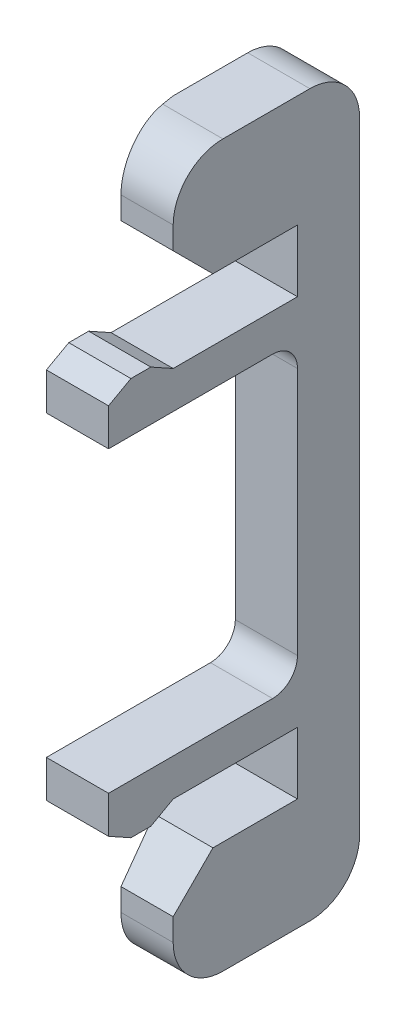
ISO-10303-21;
HEADER;
FILE_DESCRIPTION(('STEP AP214'),'2;1');
FILE_NAME('part.step','',(''),(''),'','','');
FILE_SCHEMA(('AUTOMOTIVE_DESIGN { 1 0 10303 214 1 1 1 1 }'));
ENDSEC;
DATA;
#1=APPLICATION_CONTEXT('core data for automotive mechanical design processes');
#2=APPLICATION_PROTOCOL_DEFINITION('international standard','automotive_design',2000,#1);
#3=PRODUCT_CONTEXT('',#1,'mechanical');
#4=PRODUCT('Part','Part','',(#3));
#5=PRODUCT_RELATED_PRODUCT_CATEGORY('part','',(#4));
#6=PRODUCT_DEFINITION_FORMATION('','',#4);
#7=PRODUCT_DEFINITION_CONTEXT('part definition',#1,'design');
#8=PRODUCT_DEFINITION('design','',#6,#7);
#9=PRODUCT_DEFINITION_SHAPE('','',#8);
#10=(LENGTH_UNIT() NAMED_UNIT(*) SI_UNIT(.MILLI.,.METRE.));
#11=(NAMED_UNIT(*) PLANE_ANGLE_UNIT() SI_UNIT($,.RADIAN.));
#12=(NAMED_UNIT(*) SI_UNIT($,.STERADIAN.) SOLID_ANGLE_UNIT());
#13=UNCERTAINTY_MEASURE_WITH_UNIT(LENGTH_MEASURE(1.E-05),#10,'distance_accuracy_value','');
#14=(GEOMETRIC_REPRESENTATION_CONTEXT(3) GLOBAL_UNCERTAINTY_ASSIGNED_CONTEXT((#13)) GLOBAL_UNIT_ASSIGNED_CONTEXT((#10,
#11,#12)) REPRESENTATION_CONTEXT('',''));
#15=CARTESIAN_POINT('',(0.,0.,0.));
#16=DIRECTION('',(0.,0.,1.));
#17=DIRECTION('',(1.,0.,0.));
#18=AXIS2_PLACEMENT_3D('',#15,#16,#17);
#19=CARTESIAN_POINT('',(-1.5875,-18.415,3.175));
#20=DIRECTION('',(1.,0.,0.));
#21=DIRECTION('',(0.,0.,-1.));
#22=AXIS2_PLACEMENT_3D('',#19,#20,#21);
#23=PLANE('',#22);
#24=DIRECTION('',(0.,-1.,0.));
#25=VECTOR('',#24,1.);
#26=CARTESIAN_POINT('',(-1.5875,18.416,6.35));
#27=LINE('',#26,#25);
#28=CARTESIAN_POINT('',(-1.5875,-12.7,6.35));
#29=VERTEX_POINT('',#28);
#30=CARTESIAN_POINT('',(-1.5875,-18.415,6.35));
#31=VERTEX_POINT('',#30);
#32=EDGE_CURVE('E278',#29,#31,#27,.T.);
#33=ORIENTED_EDGE('',*,*,#32,.F.);
#34=DIRECTION('',(0.,0.,-1.));
#35=VECTOR('',#34,1.);
#36=CARTESIAN_POINT('',(-1.5875,-12.7,3.175));
#37=LINE('',#36,#35);
#38=CARTESIAN_POINT('',(-1.5875,-12.7,3.175));
#39=VERTEX_POINT('',#38);
#40=EDGE_CURVE('E501',#29,#39,#37,.T.);
#41=ORIENTED_EDGE('',*,*,#40,.T.);
#42=DIRECTION('',(0.,-1.,0.));
#43=VECTOR('',#42,1.);
#44=CARTESIAN_POINT('',(-1.5875,-18.415,3.175));
#45=LINE('',#44,#43);
#46=CARTESIAN_POINT('',(-1.5875,-9.525,3.175));
#47=VERTEX_POINT('',#46);
#48=EDGE_CURVE('E523',#47,#39,#45,.T.);
#49=ORIENTED_EDGE('',*,*,#48,.F.);
#50=DIRECTION('',(0.,0.,1.));
#51=VECTOR('',#50,1.);
#52=CARTESIAN_POINT('',(-1.5875,-9.525,3.175));
#53=LINE('',#52,#51);
#54=CARTESIAN_POINT('',(-1.5875,-9.525,9.525));
#55=VERTEX_POINT('',#54);
#56=EDGE_CURVE('E392',#47,#55,#53,.T.);
#57=ORIENTED_EDGE('',*,*,#56,.T.);
#58=DIRECTION('',(0.,-0.485642931178632,0.874157276121538));
#59=VECTOR('',#58,1.);
#60=CARTESIAN_POINT('',(-1.5875,-9.525,9.525));
#61=LINE('',#60,#59);
#62=CARTESIAN_POINT('',(-1.5875,-10.16,10.668));
#63=VERTEX_POINT('',#62);
#64=EDGE_CURVE('E473',#55,#63,#61,.T.);
#65=ORIENTED_EDGE('',*,*,#64,.T.);
#66=DIRECTION('',(0.,0.,1.));
#67=VECTOR('',#66,1.);
#68=CARTESIAN_POINT('',(-1.5875,-10.16,10.668));
#69=LINE('',#68,#67);
#70=CARTESIAN_POINT('',(-1.5875,-10.16,11.684));
#71=VERTEX_POINT('',#70);
#72=EDGE_CURVE('E469',#63,#71,#69,.T.);
#73=ORIENTED_EDGE('',*,*,#72,.T.);
#74=DIRECTION('',(0.,0.485642931178633,0.874157276121537));
#75=VECTOR('',#74,1.);
#76=CARTESIAN_POINT('',(-1.5875,-10.16,11.684));
#77=LINE('',#76,#75);
#78=CARTESIAN_POINT('',(-1.5875,-9.525,12.827));
#79=VERTEX_POINT('',#78);
#80=EDGE_CURVE('E465',#71,#79,#77,.T.);
#81=ORIENTED_EDGE('',*,*,#80,.T.);
#82=DIRECTION('',(0.,1.,0.));
#83=VECTOR('',#82,1.);
#84=CARTESIAN_POINT('',(-1.5875,-9.525,12.827));
#85=LINE('',#84,#83);
#86=CARTESIAN_POINT('',(-1.5875,-7.62,12.827));
#87=VERTEX_POINT('',#86);
#88=EDGE_CURVE('E461',#79,#87,#85,.T.);
#89=ORIENTED_EDGE('',*,*,#88,.T.);
#90=DIRECTION('',(0.,0.,-1.));
#91=VECTOR('',#90,1.);
#92=CARTESIAN_POINT('',(-1.5875,-7.62,12.827));
#93=LINE('',#92,#91);
#94=CARTESIAN_POINT('',(-1.5875,-7.62,4.445));
#95=VERTEX_POINT('',#94);
#96=EDGE_CURVE('E442',#87,#95,#93,.T.);
#97=ORIENTED_EDGE('',*,*,#96,.T.);
#98=CARTESIAN_POINT('',(-1.5875,-6.35,4.445));
#99=DIRECTION('',(1.,0.,0.));
#100=DIRECTION('',(0.,0.,-1.));
#101=AXIS2_PLACEMENT_3D('',#98,#99,#100);
#102=CIRCLE('',#101,1.27);
#103=CARTESIAN_POINT('',(-1.5875,-6.35,3.175));
#104=VERTEX_POINT('',#103);
#105=EDGE_CURVE('E564',#95,#104,#102,.T.);
#106=ORIENTED_EDGE('',*,*,#105,.T.);
#107=CARTESIAN_POINT('',(-1.5875,6.35,3.175));
#108=VERTEX_POINT('',#107);
#109=EDGE_CURVE('E530',#108,#104,#45,.T.);
#110=ORIENTED_EDGE('',*,*,#109,.F.);
#111=CARTESIAN_POINT('',(-1.5875,6.35,4.445));
#112=DIRECTION('',(1.,0.,0.));
#113=DIRECTION('',(0.,0.,-1.));
#114=AXIS2_PLACEMENT_3D('',#111,#112,#113);
#115=CIRCLE('',#114,1.27);
#116=CARTESIAN_POINT('',(-1.5875,7.62,4.445));
#117=VERTEX_POINT('',#116);
#118=EDGE_CURVE('E569',#108,#117,#115,.T.);
#119=ORIENTED_EDGE('',*,*,#118,.T.);
#120=DIRECTION('',(0.,0.,1.));
#121=VECTOR('',#120,1.);
#122=CARTESIAN_POINT('',(-1.5875,7.62,12.827));
#123=LINE('',#122,#121);
#124=CARTESIAN_POINT('',(-1.5875,7.62,12.827));
#125=VERTEX_POINT('',#124);
#126=EDGE_CURVE('E388',#117,#125,#123,.T.);
#127=ORIENTED_EDGE('',*,*,#126,.T.);
#128=DIRECTION('',(0.,1.,0.));
#129=VECTOR('',#128,1.);
#130=CARTESIAN_POINT('',(-1.5875,9.525,12.827));
#131=LINE('',#130,#129);
#132=CARTESIAN_POINT('',(-1.5875,9.525,12.827));
#133=VERTEX_POINT('',#132);
#134=EDGE_CURVE('E391',#125,#133,#131,.T.);
#135=ORIENTED_EDGE('',*,*,#134,.T.);
#136=DIRECTION('',(0.,0.485642931178633,-0.874157276121537));
#137=VECTOR('',#136,1.);
#138=CARTESIAN_POINT('',(-1.5875,10.16,11.684));
#139=LINE('',#138,#137);
#140=CARTESIAN_POINT('',(-1.5875,10.16,11.684));
#141=VERTEX_POINT('',#140);
#142=EDGE_CURVE('E396',#133,#141,#139,.T.);
#143=ORIENTED_EDGE('',*,*,#142,.T.);
#144=DIRECTION('',(0.,0.,-1.));
#145=VECTOR('',#144,1.);
#146=CARTESIAN_POINT('',(-1.5875,10.16,10.668));
#147=LINE('',#146,#145);
#148=CARTESIAN_POINT('',(-1.5875,10.16,10.668));
#149=VERTEX_POINT('',#148);
#150=EDGE_CURVE('E400',#141,#149,#147,.T.);
#151=ORIENTED_EDGE('',*,*,#150,.T.);
#152=DIRECTION('',(0.,-0.485642931178632,-0.874157276121538));
#153=VECTOR('',#152,1.);
#154=CARTESIAN_POINT('',(-1.5875,9.525,9.525));
#155=LINE('',#154,#153);
#156=CARTESIAN_POINT('',(-1.5875,9.525,9.525));
#157=VERTEX_POINT('',#156);
#158=EDGE_CURVE('E404',#149,#157,#155,.T.);
#159=ORIENTED_EDGE('',*,*,#158,.T.);
#160=DIRECTION('',(0.,0.,-1.));
#161=VECTOR('',#160,1.);
#162=CARTESIAN_POINT('',(-1.5875,9.525,3.175));
#163=LINE('',#162,#161);
#164=CARTESIAN_POINT('',(-1.5875,9.525,3.175));
#165=VERTEX_POINT('',#164);
#166=EDGE_CURVE('E408',#157,#165,#163,.T.);
#167=ORIENTED_EDGE('',*,*,#166,.T.);
#168=CARTESIAN_POINT('',(-1.5875,12.7,3.175));
#169=VERTEX_POINT('',#168);
#170=EDGE_CURVE('E526',#169,#165,#45,.T.);
#171=ORIENTED_EDGE('',*,*,#170,.F.);
#172=DIRECTION('',(0.,0.,1.));
#173=VECTOR('',#172,1.);
#174=CARTESIAN_POINT('',(-1.5875,12.7,3.175));
#175=LINE('',#174,#173);
#176=CARTESIAN_POINT('',(-1.5875,12.7,6.34999999999997));
#177=VERTEX_POINT('',#176);
#178=EDGE_CURVE('E498',#169,#177,#175,.T.);
#179=ORIENTED_EDGE('',*,*,#178,.T.);
#180=DIRECTION('',(0.,1.,0.));
#181=VECTOR('',#180,1.);
#182=CARTESIAN_POINT('',(-1.5875,-18.416,6.35));
#183=LINE('',#182,#181);
#184=CARTESIAN_POINT('',(-1.5875,18.415,6.35));
#185=VERTEX_POINT('',#184);
#186=EDGE_CURVE('E355',#177,#185,#183,.T.);
#187=ORIENTED_EDGE('',*,*,#186,.T.);
#188=DIRECTION('',(0.,0.,-1.));
#189=VECTOR('',#188,1.);
#190=CARTESIAN_POINT('',(-1.5875,18.415,3.175));
#191=LINE('',#190,#189);
#192=CARTESIAN_POINT('',(-1.5875,18.415,2.54));
#193=VERTEX_POINT('',#192);
#194=EDGE_CURVE('E544',#185,#193,#191,.T.);
#195=ORIENTED_EDGE('',*,*,#194,.T.);
#196=CARTESIAN_POINT('',(-1.5875,15.875,2.54));
#197=DIRECTION('',(1.,0.,0.));
#198=DIRECTION('',(0.,0.,-1.));
#199=AXIS2_PLACEMENT_3D('',#196,#197,#198);
#200=CIRCLE('',#199,2.54);
#201=CARTESIAN_POINT('',(-1.5875,15.875,0.));
#202=VERTEX_POINT('',#201);
#203=EDGE_CURVE('E285',#193,#202,#200,.F.);
#204=ORIENTED_EDGE('',*,*,#203,.T.);
#205=DIRECTION('',(0.,-1.,0.));
#206=VECTOR('',#205,1.);
#207=CARTESIAN_POINT('',(-1.5875,-18.415,0.));
#208=LINE('',#207,#206);
#209=CARTESIAN_POINT('',(-1.5875,-15.875,0.));
#210=VERTEX_POINT('',#209);
#211=EDGE_CURVE('E534',#202,#210,#208,.T.);
#212=ORIENTED_EDGE('',*,*,#211,.T.);
#213=CARTESIAN_POINT('',(-1.5875,-15.875,2.54));
#214=DIRECTION('',(1.,0.,0.));
#215=DIRECTION('',(0.,0.,-1.));
#216=AXIS2_PLACEMENT_3D('',#213,#214,#215);
#217=CIRCLE('',#216,2.54);
#218=CARTESIAN_POINT('',(-1.5875,-18.415,2.54));
#219=VERTEX_POINT('',#218);
#220=EDGE_CURVE('E294',#210,#219,#217,.F.);
#221=ORIENTED_EDGE('',*,*,#220,.T.);
#222=DIRECTION('',(0.,0.,-1.));
#223=VECTOR('',#222,1.);
#224=CARTESIAN_POINT('',(-1.5875,-18.415,3.175));
#225=LINE('',#224,#223);
#226=EDGE_CURVE('E541',#31,#219,#225,.T.);
#227=ORIENTED_EDGE('',*,*,#226,.F.);
#228=EDGE_LOOP('',(#33,#41,#49,#57,#65,#73,#81,#89,#97,#106,#110,#119,#127,#135,#143,#151,#159,
#167,#171,#179,#187,#195,#204,#212,#221,#227));
#229=FACE_BOUND('',#228,.T.);
#230=ADVANCED_FACE('F51',(#229),#23,.F.);
#231=CARTESIAN_POINT('',(-1.5875,-18.415,3.175));
#232=DIRECTION('',(0.,1.,0.));
#233=DIRECTION('',(0.,0.,1.));
#234=AXIS2_PLACEMENT_3D('',#231,#232,#233);
#235=PLANE('',#234);
#236=DIRECTION('',(-0.157990501106673,0.,-0.987440631916705));
#237=VECTOR('',#236,1.);
#238=CARTESIAN_POINT('',(-1.5875,-18.415,6.35));
#239=LINE('',#238,#237);
#240=CARTESIAN_POINT('',(-1.4859,-18.415,6.985));
#241=VERTEX_POINT('',#240);
#242=EDGE_CURVE('E262',#241,#31,#239,.T.);
#243=ORIENTED_EDGE('',*,*,#242,.T.);
#244=ORIENTED_EDGE('',*,*,#226,.T.);
#245=DIRECTION('',(1.,0.,0.));
#246=VECTOR('',#245,1.);
#247=CARTESIAN_POINT('',(1.5875,-18.415,2.54));
#248=LINE('',#247,#246);
#249=CARTESIAN_POINT('',(1.5875,-18.415,2.54));
#250=VERTEX_POINT('',#249);
#251=EDGE_CURVE('E575',#219,#250,#248,.T.);
#252=ORIENTED_EDGE('',*,*,#251,.T.);
#253=DIRECTION('',(0.,0.,-1.));
#254=VECTOR('',#253,1.);
#255=CARTESIAN_POINT('',(1.5875,-18.415,3.175));
#256=LINE('',#255,#254);
#257=CARTESIAN_POINT('',(1.5875,-18.415,6.985));
#258=VERTEX_POINT('',#257);
#259=EDGE_CURVE('E529',#258,#250,#256,.T.);
#260=ORIENTED_EDGE('',*,*,#259,.F.);
#261=DIRECTION('',(-1.,0.,0.));
#262=VECTOR('',#261,1.);
#263=CARTESIAN_POINT('',(-1.5875,-18.415,6.985));
#264=LINE('',#263,#262);
#265=EDGE_CURVE('E579',#258,#241,#264,.T.);
#266=ORIENTED_EDGE('',*,*,#265,.T.);
#267=EDGE_LOOP('',(#243,#244,#252,#260,#266));
#268=FACE_BOUND('',#267,.T.);
#269=ADVANCED_FACE('F595',(#268),#235,.F.);
#270=CARTESIAN_POINT('',(10.1305512698918,-12.7,3.175));
#271=DIRECTION('',(0.,1.,0.));
#272=DIRECTION('',(0.,0.,1.));
#273=AXIS2_PLACEMENT_3D('',#270,#271,#272);
#274=PLANE('',#273);
#275=ORIENTED_EDGE('',*,*,#40,.F.);
#276=DIRECTION('',(-0.157990501106673,0.,-0.987440631916706));
#277=VECTOR('',#276,1.);
#278=CARTESIAN_POINT('',(-1.5875,-12.7,6.35));
#279=LINE('',#278,#277);
#280=CARTESIAN_POINT('',(-1.40462,-12.7,7.49299999999999));
#281=VERTEX_POINT('',#280);
#282=EDGE_CURVE('E370',#281,#29,#279,.T.);
#283=ORIENTED_EDGE('',*,*,#282,.F.);
#284=DIRECTION('',(1.,0.,0.));
#285=VECTOR('',#284,1.);
#286=CARTESIAN_POINT('',(10.1305512698918,-12.7,7.49299999999999));
#287=LINE('',#286,#285);
#288=CARTESIAN_POINT('',(1.5875,-12.7,7.49299999999999));
#289=VERTEX_POINT('',#288);
#290=EDGE_CURVE('E324',#281,#289,#287,.T.);
#291=ORIENTED_EDGE('',*,*,#290,.T.);
#292=DIRECTION('',(0.,0.,1.));
#293=VECTOR('',#292,1.);
#294=CARTESIAN_POINT('',(1.5875,-12.7,3.175));
#295=LINE('',#294,#293);
#296=CARTESIAN_POINT('',(1.5875,-12.7,3.175));
#297=VERTEX_POINT('',#296);
#298=EDGE_CURVE('E433',#297,#289,#295,.T.);
#299=ORIENTED_EDGE('',*,*,#298,.F.);
#300=DIRECTION('',(-1.,0.,0.));
#301=VECTOR('',#300,1.);
#302=CARTESIAN_POINT('',(10.1305512698918,-12.7,3.175));
#303=LINE('',#302,#301);
#304=EDGE_CURVE('E508',#297,#39,#303,.T.);
#305=ORIENTED_EDGE('',*,*,#304,.T.);
#306=EDGE_LOOP('',(#275,#283,#291,#299,#305));
#307=FACE_BOUND('',#306,.T.);
#308=ADVANCED_FACE('F816',(#307),#274,.T.);
#309=CARTESIAN_POINT('',(10.1305512698918,-18.415,9.525));
#310=DIRECTION('',(0.,0.,1.));
#311=DIRECTION('',(1.,0.,0.));
#312=AXIS2_PLACEMENT_3D('',#309,#310,#311);
#313=PLANE('',#312);
#314=DIRECTION('',(-1.,0.,0.));
#315=VECTOR('',#314,1.);
#316=CARTESIAN_POINT('',(10.1305512698918,-14.732,9.525));
#317=LINE('',#316,#315);
#318=CARTESIAN_POINT('',(1.5875,-14.732,9.525));
#319=VERTEX_POINT('',#318);
#320=CARTESIAN_POINT('',(-1.0795,-14.732,9.525));
#321=VERTEX_POINT('',#320);
#322=EDGE_CURVE('E276',#319,#321,#317,.T.);
#323=ORIENTED_EDGE('',*,*,#322,.T.);
#324=DIRECTION('',(0.,-1.,0.));
#325=VECTOR('',#324,1.);
#326=CARTESIAN_POINT('',(-1.0795,18.416,9.525));
#327=LINE('',#326,#325);
#328=CARTESIAN_POINT('',(-1.0795,-15.875,9.525));
#329=VERTEX_POINT('',#328);
#330=EDGE_CURVE('E68',#321,#329,#327,.T.);
#331=ORIENTED_EDGE('',*,*,#330,.T.);
#332=DIRECTION('',(-1.,0.,0.));
#333=VECTOR('',#332,1.);
#334=CARTESIAN_POINT('',(1.5875,-15.875,9.525));
#335=LINE('',#334,#333);
#336=CARTESIAN_POINT('',(1.5875,-15.875,9.525));
#337=VERTEX_POINT('',#336);
#338=EDGE_CURVE('E273',#329,#337,#335,.F.);
#339=ORIENTED_EDGE('',*,*,#338,.T.);
#340=DIRECTION('',(0.,-1.,0.));
#341=VECTOR('',#340,1.);
#342=CARTESIAN_POINT('',(1.5875,-18.415,9.525));
#343=LINE('',#342,#341);
#344=EDGE_CURVE('E512',#319,#337,#343,.T.);
#345=ORIENTED_EDGE('',*,*,#344,.F.);
#346=EDGE_LOOP('',(#323,#331,#339,#345));
#347=FACE_BOUND('',#346,.T.);
#348=ADVANCED_FACE('F271',(#347),#313,.T.);
#349=CARTESIAN_POINT('',(-1.5875,-15.875,6.985));
#350=DIRECTION('',(1.,0.,0.));
#351=DIRECTION('',(0.,0.,-1.));
#352=AXIS2_PLACEMENT_3D('',#349,#350,#351);
#353=CYLINDRICAL_SURFACE('',#352,2.54);
#354=ORIENTED_EDGE('',*,*,#338,.F.);
#355=CARTESIAN_POINT('',(-1.4859,-15.875,6.985));
#356=DIRECTION('',(-0.987440631916705,0.,0.157990501106673));
#357=DIRECTION('',(0.157990501106673,0.,0.987440631916706));
#358=AXIS2_PLACEMENT_3D('',#355,#356,#357);
#359=ELLIPSE('',#358,2.57230654471818,2.54);
#360=EDGE_CURVE('E259',#241,#329,#359,.T.);
#361=ORIENTED_EDGE('',*,*,#360,.F.);
#362=ORIENTED_EDGE('',*,*,#265,.F.);
#363=CARTESIAN_POINT('',(1.5875,-15.875,6.985));
#364=DIRECTION('',(-1.,0.,0.));
#365=DIRECTION('',(0.,0.,1.));
#366=AXIS2_PLACEMENT_3D('',#363,#364,#365);
#367=CIRCLE('',#366,2.54);
#368=EDGE_CURVE('E282',#337,#258,#367,.F.);
#369=ORIENTED_EDGE('',*,*,#368,.F.);
#370=EDGE_LOOP('',(#354,#361,#362,#369));
#371=FACE_BOUND('',#370,.T.);
#372=ADVANCED_FACE('F281',(#371),#353,.T.);
#373=CARTESIAN_POINT('',(10.1305512698918,-14.732,9.525));
#374=DIRECTION('',(0.,-0.707106781186549,-0.707106781186546));
#375=DIRECTION('',(-1.,0.,0.));
#376=AXIS2_PLACEMENT_3D('',#373,#374,#375);
#377=PLANE('',#376);
#378=ORIENTED_EDGE('',*,*,#290,.F.);
#379=DIRECTION('',(0.112419885463869,-0.702624284149177,0.70262428414918));
#380=VECTOR('',#379,1.);
#381=CARTESIAN_POINT('',(-3.9550355450237,3.24009715639805,-8.44709715639811));
#382=LINE('',#381,#380);
#383=EDGE_CURVE('E603',#321,#281,#382,.F.);
#384=ORIENTED_EDGE('',*,*,#383,.F.);
#385=ORIENTED_EDGE('',*,*,#322,.F.);
#386=DIRECTION('',(0.,0.707106781186546,-0.707106781186549));
#387=VECTOR('',#386,1.);
#388=CARTESIAN_POINT('',(1.5875,-14.732,9.525));
#389=LINE('',#388,#387);
#390=EDGE_CURVE('E330',#289,#319,#389,.F.);
#391=ORIENTED_EDGE('',*,*,#390,.F.);
#392=EDGE_LOOP('',(#378,#384,#385,#391));
#393=FACE_BOUND('',#392,.T.);
#394=ADVANCED_FACE('F602',(#393),#377,.F.);
#395=CARTESIAN_POINT('',(0.,0.,3.175));
#396=DIRECTION('',(0.,0.,-1.));
#397=DIRECTION('',(-1.,0.,0.));
#398=AXIS2_PLACEMENT_3D('',#395,#396,#397);
#399=PLANE('',#398);
#400=ORIENTED_EDGE('',*,*,#170,.T.);
#401=DIRECTION('',(-1.,0.,0.));
#402=VECTOR('',#401,1.);
#403=CARTESIAN_POINT('',(11.5681164138294,9.525,3.175));
#404=LINE('',#403,#402);
#405=CARTESIAN_POINT('',(1.5875,9.525,3.175));
#406=VERTEX_POINT('',#405);
#407=EDGE_CURVE('E375',#406,#165,#404,.T.);
#408=ORIENTED_EDGE('',*,*,#407,.F.);
#409=DIRECTION('',(0.,1.,0.));
#410=VECTOR('',#409,1.);
#411=CARTESIAN_POINT('',(1.5875,-18.415,3.175));
#412=LINE('',#411,#410);
#413=CARTESIAN_POINT('',(1.5875,12.7,3.175));
#414=VERTEX_POINT('',#413);
#415=EDGE_CURVE('E525',#406,#414,#412,.T.);
#416=ORIENTED_EDGE('',*,*,#415,.T.);
#417=DIRECTION('',(-1.,0.,0.));
#418=VECTOR('',#417,1.);
#419=CARTESIAN_POINT('',(10.1305512698918,12.7,3.175));
#420=LINE('',#419,#418);
#421=EDGE_CURVE('E497',#414,#169,#420,.T.);
#422=ORIENTED_EDGE('',*,*,#421,.T.);
#423=EDGE_LOOP('',(#400,#408,#416,#422));
#424=FACE_BOUND('',#423,.T.);
#425=ADVANCED_FACE('F736',(#424),#399,.F.);
#426=ORIENTED_EDGE('',*,*,#109,.T.);
#427=DIRECTION('',(-1.,0.,0.));
#428=VECTOR('',#427,1.);
#429=CARTESIAN_POINT('',(0.,-6.35,3.175));
#430=LINE('',#429,#428);
#431=CARTESIAN_POINT('',(1.5875,-6.35,3.175));
#432=VERTEX_POINT('',#431);
#433=EDGE_CURVE('E559',#104,#432,#430,.F.);
#434=ORIENTED_EDGE('',*,*,#433,.T.);
#435=CARTESIAN_POINT('',(1.5875,6.35,3.175));
#436=VERTEX_POINT('',#435);
#437=EDGE_CURVE('E524',#432,#436,#412,.T.);
#438=ORIENTED_EDGE('',*,*,#437,.T.);
#439=DIRECTION('',(-1.,0.,0.));
#440=VECTOR('',#439,1.);
#441=CARTESIAN_POINT('',(0.,6.35,3.175));
#442=LINE('',#441,#440);
#443=EDGE_CURVE('E555',#436,#108,#442,.T.);
#444=ORIENTED_EDGE('',*,*,#443,.T.);
#445=EDGE_LOOP('',(#426,#434,#438,#444));
#446=FACE_BOUND('',#445,.T.);
#447=ADVANCED_FACE('F773',(#446),#399,.F.);
#448=CARTESIAN_POINT('',(1.5875,-9.525,3.175));
#449=VERTEX_POINT('',#448);
#450=EDGE_CURVE('E520',#297,#449,#412,.T.);
#451=ORIENTED_EDGE('',*,*,#450,.T.);
#452=DIRECTION('',(-1.,0.,0.));
#453=VECTOR('',#452,1.);
#454=CARTESIAN_POINT('',(11.5681164138294,-9.525,3.175));
#455=LINE('',#454,#453);
#456=EDGE_CURVE('E438',#449,#47,#455,.T.);
#457=ORIENTED_EDGE('',*,*,#456,.T.);
#458=ORIENTED_EDGE('',*,*,#48,.T.);
#459=ORIENTED_EDGE('',*,*,#304,.F.);
#460=EDGE_LOOP('',(#451,#457,#458,#459));
#461=FACE_BOUND('',#460,.T.);
#462=ADVANCED_FACE('F813',(#461),#399,.F.);
#463=CARTESIAN_POINT('',(1.5875,-18.415,3.175));
#464=DIRECTION('',(-1.,0.,0.));
#465=DIRECTION('',(0.,0.,1.));
#466=AXIS2_PLACEMENT_3D('',#463,#464,#465);
#467=PLANE('',#466);
#468=ORIENTED_EDGE('',*,*,#298,.T.);
#469=ORIENTED_EDGE('',*,*,#390,.T.);
#470=ORIENTED_EDGE('',*,*,#344,.T.);
#471=ORIENTED_EDGE('',*,*,#368,.T.);
#472=ORIENTED_EDGE('',*,*,#259,.T.);
#473=CARTESIAN_POINT('',(1.5875,-15.875,2.54));
#474=DIRECTION('',(-1.,0.,0.));
#475=DIRECTION('',(0.,0.,1.));
#476=AXIS2_PLACEMENT_3D('',#473,#474,#475);
#477=CIRCLE('',#476,2.54);
#478=CARTESIAN_POINT('',(1.5875,-15.875,0.));
#479=VERTEX_POINT('',#478);
#480=EDGE_CURVE('E284',#250,#479,#477,.F.);
#481=ORIENTED_EDGE('',*,*,#480,.T.);
#482=DIRECTION('',(0.,1.,0.));
#483=VECTOR('',#482,1.);
#484=CARTESIAN_POINT('',(1.5875,-18.415,0.));
#485=LINE('',#484,#483);
#486=CARTESIAN_POINT('',(1.5875,15.875,0.));
#487=VERTEX_POINT('',#486);
#488=EDGE_CURVE('E507',#479,#487,#485,.T.);
#489=ORIENTED_EDGE('',*,*,#488,.T.);
#490=CARTESIAN_POINT('',(1.5875,15.875,2.54));
#491=DIRECTION('',(-1.,0.,0.));
#492=DIRECTION('',(0.,0.,1.));
#493=AXIS2_PLACEMENT_3D('',#490,#491,#492);
#494=CIRCLE('',#493,2.54);
#495=CARTESIAN_POINT('',(1.5875,18.415,2.54));
#496=VERTEX_POINT('',#495);
#497=EDGE_CURVE('E291',#487,#496,#494,.F.);
#498=ORIENTED_EDGE('',*,*,#497,.T.);
#499=DIRECTION('',(0.,0.,-1.));
#500=VECTOR('',#499,1.);
#501=CARTESIAN_POINT('',(1.5875,18.415,3.175));
#502=LINE('',#501,#500);
#503=CARTESIAN_POINT('',(1.5875,18.415,6.985));
#504=VERTEX_POINT('',#503);
#505=EDGE_CURVE('E547',#504,#496,#502,.T.);
#506=ORIENTED_EDGE('',*,*,#505,.F.);
#507=CARTESIAN_POINT('',(1.5875,15.875,6.985));
#508=DIRECTION('',(-1.,0.,0.));
#509=DIRECTION('',(0.,0.,1.));
#510=AXIS2_PLACEMENT_3D('',#507,#508,#509);
#511=CIRCLE('',#510,2.54);
#512=CARTESIAN_POINT('',(1.5875,15.875,9.525));
#513=VERTEX_POINT('',#512);
#514=EDGE_CURVE('E300',#504,#513,#511,.F.);
#515=ORIENTED_EDGE('',*,*,#514,.T.);
#516=DIRECTION('',(0.,-1.,0.));
#517=VECTOR('',#516,1.);
#518=CARTESIAN_POINT('',(1.5875,18.415,9.525));
#519=LINE('',#518,#517);
#520=CARTESIAN_POINT('',(1.5875,14.732,9.525));
#521=VERTEX_POINT('',#520);
#522=EDGE_CURVE('E493',#513,#521,#519,.T.);
#523=ORIENTED_EDGE('',*,*,#522,.T.);
#524=DIRECTION('',(0.,0.707106781186549,0.707106781186546));
#525=VECTOR('',#524,1.);
#526=CARTESIAN_POINT('',(1.5875,12.7,7.493));
#527=LINE('',#526,#525);
#528=CARTESIAN_POINT('',(1.5875,12.7,7.493));
#529=VERTEX_POINT('',#528);
#530=EDGE_CURVE('E327',#521,#529,#527,.F.);
#531=ORIENTED_EDGE('',*,*,#530,.T.);
#532=DIRECTION('',(0.,0.,-1.));
#533=VECTOR('',#532,1.);
#534=CARTESIAN_POINT('',(1.5875,12.7,3.175));
#535=LINE('',#534,#533);
#536=EDGE_CURVE('E342',#529,#414,#535,.T.);
#537=ORIENTED_EDGE('',*,*,#536,.T.);
#538=ORIENTED_EDGE('',*,*,#415,.F.);
#539=DIRECTION('',(0.,0.,1.));
#540=VECTOR('',#539,1.);
#541=CARTESIAN_POINT('',(1.5875,9.525,3.175));
#542=LINE('',#541,#540);
#543=CARTESIAN_POINT('',(1.5875,9.525,9.525));
#544=VERTEX_POINT('',#543);
#545=EDGE_CURVE('E384',#406,#544,#542,.T.);
#546=ORIENTED_EDGE('',*,*,#545,.T.);
#547=DIRECTION('',(0.,0.485642931178632,0.874157276121538));
#548=VECTOR('',#547,1.);
#549=CARTESIAN_POINT('',(1.5875,9.525,9.525));
#550=LINE('',#549,#548);
#551=CARTESIAN_POINT('',(1.5875,10.16,10.668));
#552=VERTEX_POINT('',#551);
#553=EDGE_CURVE('E381',#544,#552,#550,.T.);
#554=ORIENTED_EDGE('',*,*,#553,.T.);
#555=DIRECTION('',(0.,0.,1.));
#556=VECTOR('',#555,1.);
#557=CARTESIAN_POINT('',(1.5875,10.16,10.668));
#558=LINE('',#557,#556);
#559=CARTESIAN_POINT('',(1.5875,10.16,11.684));
#560=VERTEX_POINT('',#559);
#561=EDGE_CURVE('E378',#552,#560,#558,.T.);
#562=ORIENTED_EDGE('',*,*,#561,.T.);
#563=DIRECTION('',(0.,-0.485642931178633,0.874157276121537));
#564=VECTOR('',#563,1.);
#565=CARTESIAN_POINT('',(1.5875,10.16,11.684));
#566=LINE('',#565,#564);
#567=CARTESIAN_POINT('',(1.5875,9.525,12.827));
#568=VERTEX_POINT('',#567);
#569=EDGE_CURVE('E374',#560,#568,#566,.T.);
#570=ORIENTED_EDGE('',*,*,#569,.T.);
#571=DIRECTION('',(0.,-1.,0.));
#572=VECTOR('',#571,1.);
#573=CARTESIAN_POINT('',(1.5875,9.525,12.827));
#574=LINE('',#573,#572);
#575=CARTESIAN_POINT('',(1.5875,7.62,12.827));
#576=VERTEX_POINT('',#575);
#577=EDGE_CURVE('E371',#568,#576,#574,.T.);
#578=ORIENTED_EDGE('',*,*,#577,.T.);
#579=DIRECTION('',(0.,0.,-1.));
#580=VECTOR('',#579,1.);
#581=CARTESIAN_POINT('',(1.5875,7.62,12.827));
#582=LINE('',#581,#580);
#583=CARTESIAN_POINT('',(1.5875,7.62,4.445));
#584=VERTEX_POINT('',#583);
#585=EDGE_CURVE('E387',#576,#584,#582,.T.);
#586=ORIENTED_EDGE('',*,*,#585,.T.);
#587=CARTESIAN_POINT('',(1.5875,6.35,4.445));
#588=DIRECTION('',(-1.,0.,0.));
#589=DIRECTION('',(0.,0.,1.));
#590=AXIS2_PLACEMENT_3D('',#587,#588,#589);
#591=CIRCLE('',#590,1.27);
#592=EDGE_CURVE('E572',#584,#436,#591,.T.);
#593=ORIENTED_EDGE('',*,*,#592,.T.);
#594=ORIENTED_EDGE('',*,*,#437,.F.);
#595=CARTESIAN_POINT('',(1.5875,-6.35,4.445));
#596=DIRECTION('',(-1.,0.,0.));
#597=DIRECTION('',(0.,0.,1.));
#598=AXIS2_PLACEMENT_3D('',#595,#596,#597);
#599=CIRCLE('',#598,1.27);
#600=CARTESIAN_POINT('',(1.5875,-7.62,4.445));
#601=VERTEX_POINT('',#600);
#602=EDGE_CURVE('E567',#432,#601,#599,.T.);
#603=ORIENTED_EDGE('',*,*,#602,.T.);
#604=DIRECTION('',(0.,0.,1.));
#605=VECTOR('',#604,1.);
#606=CARTESIAN_POINT('',(1.5875,-7.62,12.827));
#607=LINE('',#606,#605);
#608=CARTESIAN_POINT('',(1.5875,-7.62,12.827));
#609=VERTEX_POINT('',#608);
#610=EDGE_CURVE('E437',#601,#609,#607,.T.);
#611=ORIENTED_EDGE('',*,*,#610,.T.);
#612=DIRECTION('',(0.,-1.,0.));
#613=VECTOR('',#612,1.);
#614=CARTESIAN_POINT('',(1.5875,-9.525,12.827));
#615=LINE('',#614,#613);
#616=CARTESIAN_POINT('',(1.5875,-9.525,12.827));
#617=VERTEX_POINT('',#616);
#618=EDGE_CURVE('E482',#609,#617,#615,.T.);
#619=ORIENTED_EDGE('',*,*,#618,.T.);
#620=DIRECTION('',(0.,-0.485642931178633,-0.874157276121537));
#621=VECTOR('',#620,1.);
#622=CARTESIAN_POINT('',(1.5875,-10.16,11.684));
#623=LINE('',#622,#621);
#624=CARTESIAN_POINT('',(1.5875,-10.16,11.684));
#625=VERTEX_POINT('',#624);
#626=EDGE_CURVE('E485',#617,#625,#623,.T.);
#627=ORIENTED_EDGE('',*,*,#626,.T.);
#628=DIRECTION('',(0.,0.,-1.));
#629=VECTOR('',#628,1.);
#630=CARTESIAN_POINT('',(1.5875,-10.16,10.668));
#631=LINE('',#630,#629);
#632=CARTESIAN_POINT('',(1.5875,-10.16,10.668));
#633=VERTEX_POINT('',#632);
#634=EDGE_CURVE('E488',#625,#633,#631,.T.);
#635=ORIENTED_EDGE('',*,*,#634,.T.);
#636=DIRECTION('',(0.,0.485642931178632,-0.874157276121538));
#637=VECTOR('',#636,1.);
#638=CARTESIAN_POINT('',(1.5875,-9.525,9.525));
#639=LINE('',#638,#637);
#640=CARTESIAN_POINT('',(1.5875,-9.525,9.525));
#641=VERTEX_POINT('',#640);
#642=EDGE_CURVE('E457',#633,#641,#639,.T.);
#643=ORIENTED_EDGE('',*,*,#642,.T.);
#644=DIRECTION('',(0.,0.,-1.));
#645=VECTOR('',#644,1.);
#646=CARTESIAN_POINT('',(1.5875,-9.525,3.175));
#647=LINE('',#646,#645);
#648=EDGE_CURVE('E366',#641,#449,#647,.T.);
#649=ORIENTED_EDGE('',*,*,#648,.T.);
#650=ORIENTED_EDGE('',*,*,#450,.F.);
#651=EDGE_LOOP('',(#468,#469,#470,#471,#472,#481,#489,#498,#506,#515,#523,#531,#537,#538,#546,
#554,#562,#570,#578,#586,#593,#594,#603,#611,#619,#627,#635,#643,#649,#650));
#652=FACE_BOUND('',#651,.T.);
#653=ADVANCED_FACE('F597',(#652),#467,.F.);
#654=CARTESIAN_POINT('',(-1.5875,18.415,3.175));
#655=DIRECTION('',(0.,-1.,0.));
#656=DIRECTION('',(0.,0.,-1.));
#657=AXIS2_PLACEMENT_3D('',#654,#655,#656);
#658=PLANE('',#657);
#659=ORIENTED_EDGE('',*,*,#194,.F.);
#660=DIRECTION('',(-0.157990501106673,0.,-0.987440631916705));
#661=VECTOR('',#660,1.);
#662=CARTESIAN_POINT('',(-1.5875,18.415,6.35));
#663=LINE('',#662,#661);
#664=CARTESIAN_POINT('',(-1.4859,18.415,6.985));
#665=VERTEX_POINT('',#664);
#666=EDGE_CURVE('E359',#665,#185,#663,.T.);
#667=ORIENTED_EDGE('',*,*,#666,.F.);
#668=DIRECTION('',(-1.,0.,0.));
#669=VECTOR('',#668,1.);
#670=CARTESIAN_POINT('',(1.5875,18.415,6.985));
#671=LINE('',#670,#669);
#672=EDGE_CURVE('E313',#665,#504,#671,.F.);
#673=ORIENTED_EDGE('',*,*,#672,.T.);
#674=ORIENTED_EDGE('',*,*,#505,.T.);
#675=DIRECTION('',(-1.,0.,0.));
#676=VECTOR('',#675,1.);
#677=CARTESIAN_POINT('',(-1.5875,18.415,2.54));
#678=LINE('',#677,#676);
#679=EDGE_CURVE('E309',#496,#193,#678,.T.);
#680=ORIENTED_EDGE('',*,*,#679,.T.);
#681=EDGE_LOOP('',(#659,#667,#673,#674,#680));
#682=FACE_BOUND('',#681,.T.);
#683=ADVANCED_FACE('F717',(#682),#658,.F.);
#684=CARTESIAN_POINT('',(0.,0.,0.));
#685=DIRECTION('',(0.,0.,-1.));
#686=DIRECTION('',(-1.,0.,0.));
#687=AXIS2_PLACEMENT_3D('',#684,#685,#686);
#688=PLANE('',#687);
#689=ORIENTED_EDGE('',*,*,#211,.F.);
#690=DIRECTION('',(-1.,0.,0.));
#691=VECTOR('',#690,1.);
#692=CARTESIAN_POINT('',(1.5875,15.875,0.));
#693=LINE('',#692,#691);
#694=EDGE_CURVE('E319',#202,#487,#693,.F.);
#695=ORIENTED_EDGE('',*,*,#694,.T.);
#696=ORIENTED_EDGE('',*,*,#488,.F.);
#697=DIRECTION('',(1.,0.,0.));
#698=VECTOR('',#697,1.);
#699=CARTESIAN_POINT('',(-1.5875,-15.875,0.));
#700=LINE('',#699,#698);
#701=EDGE_CURVE('E316',#479,#210,#700,.F.);
#702=ORIENTED_EDGE('',*,*,#701,.T.);
#703=EDGE_LOOP('',(#689,#695,#696,#702));
#704=FACE_BOUND('',#703,.T.);
#705=ADVANCED_FACE('F725',(#704),#688,.T.);
#706=CARTESIAN_POINT('',(10.1305512698918,18.415,9.525));
#707=DIRECTION('',(0.,0.,1.));
#708=DIRECTION('',(1.,0.,0.));
#709=AXIS2_PLACEMENT_3D('',#706,#707,#708);
#710=PLANE('',#709);
#711=DIRECTION('',(0.,1.,0.));
#712=VECTOR('',#711,1.);
#713=CARTESIAN_POINT('',(-1.0795,-18.416,9.525));
#714=LINE('',#713,#712);
#715=CARTESIAN_POINT('',(-1.0795,14.732,9.525));
#716=VERTEX_POINT('',#715);
#717=CARTESIAN_POINT('',(-1.0795,15.875,9.525));
#718=VERTEX_POINT('',#717);
#719=EDGE_CURVE('E367',#716,#718,#714,.T.);
#720=ORIENTED_EDGE('',*,*,#719,.F.);
#721=DIRECTION('',(1.,0.,0.));
#722=VECTOR('',#721,1.);
#723=CARTESIAN_POINT('',(10.1305512698918,14.732,9.525));
#724=LINE('',#723,#722);
#725=EDGE_CURVE('E11',#716,#521,#724,.T.);
#726=ORIENTED_EDGE('',*,*,#725,.T.);
#727=ORIENTED_EDGE('',*,*,#522,.F.);
#728=DIRECTION('',(-1.,0.,0.));
#729=VECTOR('',#728,1.);
#730=CARTESIAN_POINT('',(-1.5875,15.875,9.525));
#731=LINE('',#730,#729);
#732=EDGE_CURVE('E305',#513,#718,#731,.T.);
#733=ORIENTED_EDGE('',*,*,#732,.T.);
#734=EDGE_LOOP('',(#720,#726,#727,#733));
#735=FACE_BOUND('',#734,.T.);
#736=ADVANCED_FACE('F732',(#735),#710,.T.);
#737=CARTESIAN_POINT('',(10.1305512698918,12.7,3.175));
#738=DIRECTION('',(0.,-1.,0.));
#739=DIRECTION('',(0.,0.,-1.));
#740=AXIS2_PLACEMENT_3D('',#737,#738,#739);
#741=PLANE('',#740);
#742=DIRECTION('',(-0.157990501106673,0.,-0.987440631916706));
#743=VECTOR('',#742,1.);
#744=CARTESIAN_POINT('',(-1.5875,12.7,6.35));
#745=LINE('',#744,#743);
#746=CARTESIAN_POINT('',(-1.40462,12.7,7.493));
#747=VERTEX_POINT('',#746);
#748=EDGE_CURVE('E76',#747,#177,#745,.T.);
#749=ORIENTED_EDGE('',*,*,#748,.T.);
#750=ORIENTED_EDGE('',*,*,#178,.F.);
#751=ORIENTED_EDGE('',*,*,#421,.F.);
#752=ORIENTED_EDGE('',*,*,#536,.F.);
#753=DIRECTION('',(-1.,0.,0.));
#754=VECTOR('',#753,1.);
#755=CARTESIAN_POINT('',(10.1305512698918,12.7,7.493));
#756=LINE('',#755,#754);
#757=EDGE_CURVE('E61',#529,#747,#756,.T.);
#758=ORIENTED_EDGE('',*,*,#757,.T.);
#759=EDGE_LOOP('',(#749,#750,#751,#752,#758));
#760=FACE_BOUND('',#759,.T.);
#761=ADVANCED_FACE('F339',(#760),#741,.T.);
#762=CARTESIAN_POINT('',(11.5681164138294,-7.62,12.827));
#763=DIRECTION('',(0.,1.,0.));
#764=DIRECTION('',(0.,0.,1.));
#765=AXIS2_PLACEMENT_3D('',#762,#763,#764);
#766=PLANE('',#765);
#767=ORIENTED_EDGE('',*,*,#610,.F.);
#768=DIRECTION('',(-1.,0.,0.));
#769=VECTOR('',#768,1.);
#770=CARTESIAN_POINT('',(11.5681164138294,-7.62,4.445));
#771=LINE('',#770,#769);
#772=EDGE_CURVE('E551',#601,#95,#771,.T.);
#773=ORIENTED_EDGE('',*,*,#772,.T.);
#774=ORIENTED_EDGE('',*,*,#96,.F.);
#775=DIRECTION('',(-1.,0.,0.));
#776=VECTOR('',#775,1.);
#777=CARTESIAN_POINT('',(11.5681164138294,-7.62,12.827));
#778=LINE('',#777,#776);
#779=EDGE_CURVE('E455',#609,#87,#778,.T.);
#780=ORIENTED_EDGE('',*,*,#779,.F.);
#781=EDGE_LOOP('',(#767,#773,#774,#780));
#782=FACE_BOUND('',#781,.T.);
#783=ADVANCED_FACE('F782',(#782),#766,.T.);
#784=CARTESIAN_POINT('',(11.5681164138294,-9.525,12.827));
#785=DIRECTION('',(0.,0.,1.));
#786=DIRECTION('',(1.,0.,0.));
#787=AXIS2_PLACEMENT_3D('',#784,#785,#786);
#788=PLANE('',#787);
#789=ORIENTED_EDGE('',*,*,#618,.F.);
#790=ORIENTED_EDGE('',*,*,#779,.T.);
#791=ORIENTED_EDGE('',*,*,#88,.F.);
#792=DIRECTION('',(-1.,0.,0.));
#793=VECTOR('',#792,1.);
#794=CARTESIAN_POINT('',(11.5681164138294,-9.525,12.827));
#795=LINE('',#794,#793);
#796=EDGE_CURVE('E452',#617,#79,#795,.T.);
#797=ORIENTED_EDGE('',*,*,#796,.F.);
#798=EDGE_LOOP('',(#789,#790,#791,#797));
#799=FACE_BOUND('',#798,.T.);
#800=ADVANCED_FACE('F788',(#799),#788,.T.);
#801=CARTESIAN_POINT('',(11.5681164138294,-10.16,11.684));
#802=DIRECTION('',(0.,-0.874157276121537,0.485642931178633));
#803=DIRECTION('',(0.,-0.485642931178633,-0.874157276121537));
#804=AXIS2_PLACEMENT_3D('',#801,#802,#803);
#805=PLANE('',#804);
#806=ORIENTED_EDGE('',*,*,#626,.F.);
#807=ORIENTED_EDGE('',*,*,#796,.T.);
#808=ORIENTED_EDGE('',*,*,#80,.F.);
#809=DIRECTION('',(-1.,0.,0.));
#810=VECTOR('',#809,1.);
#811=CARTESIAN_POINT('',(11.5681164138294,-10.16,11.684));
#812=LINE('',#811,#810);
#813=EDGE_CURVE('E449',#625,#71,#812,.T.);
#814=ORIENTED_EDGE('',*,*,#813,.F.);
#815=EDGE_LOOP('',(#806,#807,#808,#814));
#816=FACE_BOUND('',#815,.T.);
#817=ADVANCED_FACE('F792',(#816),#805,.T.);
#818=CARTESIAN_POINT('',(11.5681164138294,-10.16,10.668));
#819=DIRECTION('',(0.,-1.,0.));
#820=DIRECTION('',(0.,0.,-1.));
#821=AXIS2_PLACEMENT_3D('',#818,#819,#820);
#822=PLANE('',#821);
#823=ORIENTED_EDGE('',*,*,#634,.F.);
#824=ORIENTED_EDGE('',*,*,#813,.T.);
#825=ORIENTED_EDGE('',*,*,#72,.F.);
#826=DIRECTION('',(-1.,0.,0.));
#827=VECTOR('',#826,1.);
#828=CARTESIAN_POINT('',(11.5681164138294,-10.16,10.668));
#829=LINE('',#828,#827);
#830=EDGE_CURVE('E446',#633,#63,#829,.T.);
#831=ORIENTED_EDGE('',*,*,#830,.F.);
#832=EDGE_LOOP('',(#823,#824,#825,#831));
#833=FACE_BOUND('',#832,.T.);
#834=ADVANCED_FACE('F798',(#833),#822,.T.);
#835=CARTESIAN_POINT('',(11.5681164138294,-9.525,9.525));
#836=DIRECTION('',(0.,-0.874157276121538,-0.485642931178632));
#837=DIRECTION('',(0.,0.485642931178632,-0.874157276121538));
#838=AXIS2_PLACEMENT_3D('',#835,#836,#837);
#839=PLANE('',#838);
#840=ORIENTED_EDGE('',*,*,#642,.F.);
#841=ORIENTED_EDGE('',*,*,#830,.T.);
#842=ORIENTED_EDGE('',*,*,#64,.F.);
#843=DIRECTION('',(-1.,0.,0.));
#844=VECTOR('',#843,1.);
#845=CARTESIAN_POINT('',(11.5681164138294,-9.525,9.525));
#846=LINE('',#845,#844);
#847=EDGE_CURVE('E443',#641,#55,#846,.T.);
#848=ORIENTED_EDGE('',*,*,#847,.F.);
#849=EDGE_LOOP('',(#840,#841,#842,#848));
#850=FACE_BOUND('',#849,.T.);
#851=ADVANCED_FACE('F802',(#850),#839,.T.);
#852=CARTESIAN_POINT('',(11.5681164138294,-9.525,3.175));
#853=DIRECTION('',(0.,-1.,0.));
#854=DIRECTION('',(0.,0.,-1.));
#855=AXIS2_PLACEMENT_3D('',#852,#853,#854);
#856=PLANE('',#855);
#857=ORIENTED_EDGE('',*,*,#648,.F.);
#858=ORIENTED_EDGE('',*,*,#847,.T.);
#859=ORIENTED_EDGE('',*,*,#56,.F.);
#860=ORIENTED_EDGE('',*,*,#456,.F.);
#861=EDGE_LOOP('',(#857,#858,#859,#860));
#862=FACE_BOUND('',#861,.T.);
#863=ADVANCED_FACE('F810',(#862),#856,.T.);
#864=CARTESIAN_POINT('',(11.5681164138294,9.525,3.175));
#865=DIRECTION('',(0.,1.,0.));
#866=DIRECTION('',(0.,0.,1.));
#867=AXIS2_PLACEMENT_3D('',#864,#865,#866);
#868=PLANE('',#867);
#869=ORIENTED_EDGE('',*,*,#545,.F.);
#870=ORIENTED_EDGE('',*,*,#407,.T.);
#871=ORIENTED_EDGE('',*,*,#166,.F.);
#872=DIRECTION('',(-1.,0.,0.));
#873=VECTOR('',#872,1.);
#874=CARTESIAN_POINT('',(11.5681164138294,9.525,9.525));
#875=LINE('',#874,#873);
#876=EDGE_CURVE('E416',#544,#157,#875,.T.);
#877=ORIENTED_EDGE('',*,*,#876,.F.);
#878=EDGE_LOOP('',(#869,#870,#871,#877));
#879=FACE_BOUND('',#878,.T.);
#880=ADVANCED_FACE('F739',(#879),#868,.T.);
#881=CARTESIAN_POINT('',(11.5681164138294,9.525,9.525));
#882=DIRECTION('',(0.,0.874157276121538,-0.485642931178632));
#883=DIRECTION('',(0.,0.485642931178632,0.874157276121538));
#884=AXIS2_PLACEMENT_3D('',#881,#882,#883);
#885=PLANE('',#884);
#886=ORIENTED_EDGE('',*,*,#553,.F.);
#887=ORIENTED_EDGE('',*,*,#876,.T.);
#888=ORIENTED_EDGE('',*,*,#158,.F.);
#889=DIRECTION('',(-1.,0.,0.));
#890=VECTOR('',#889,1.);
#891=CARTESIAN_POINT('',(11.5681164138294,10.16,10.668));
#892=LINE('',#891,#890);
#893=EDGE_CURVE('E419',#552,#149,#892,.T.);
#894=ORIENTED_EDGE('',*,*,#893,.F.);
#895=EDGE_LOOP('',(#886,#887,#888,#894));
#896=FACE_BOUND('',#895,.T.);
#897=ADVANCED_FACE('F746',(#896),#885,.T.);
#898=CARTESIAN_POINT('',(11.5681164138294,10.16,10.668));
#899=DIRECTION('',(0.,1.,0.));
#900=DIRECTION('',(0.,0.,1.));
#901=AXIS2_PLACEMENT_3D('',#898,#899,#900);
#902=PLANE('',#901);
#903=ORIENTED_EDGE('',*,*,#561,.F.);
#904=ORIENTED_EDGE('',*,*,#893,.T.);
#905=ORIENTED_EDGE('',*,*,#150,.F.);
#906=DIRECTION('',(-1.,0.,0.));
#907=VECTOR('',#906,1.);
#908=CARTESIAN_POINT('',(11.5681164138294,10.16,11.684));
#909=LINE('',#908,#907);
#910=EDGE_CURVE('E421',#560,#141,#909,.T.);
#911=ORIENTED_EDGE('',*,*,#910,.F.);
#912=EDGE_LOOP('',(#903,#904,#905,#911));
#913=FACE_BOUND('',#912,.T.);
#914=ADVANCED_FACE('F751',(#913),#902,.T.);
#915=CARTESIAN_POINT('',(11.5681164138294,10.16,11.684));
#916=DIRECTION('',(0.,0.874157276121537,0.485642931178633));
#917=DIRECTION('',(0.,-0.485642931178633,0.874157276121537));
#918=AXIS2_PLACEMENT_3D('',#915,#916,#917);
#919=PLANE('',#918);
#920=ORIENTED_EDGE('',*,*,#569,.F.);
#921=ORIENTED_EDGE('',*,*,#910,.T.);
#922=ORIENTED_EDGE('',*,*,#142,.F.);
#923=DIRECTION('',(-1.,0.,0.));
#924=VECTOR('',#923,1.);
#925=CARTESIAN_POINT('',(11.5681164138294,9.525,12.827));
#926=LINE('',#925,#924);
#927=EDGE_CURVE('E424',#568,#133,#926,.T.);
#928=ORIENTED_EDGE('',*,*,#927,.F.);
#929=EDGE_LOOP('',(#920,#921,#922,#928));
#930=FACE_BOUND('',#929,.T.);
#931=ADVANCED_FACE('F754',(#930),#919,.T.);
#932=CARTESIAN_POINT('',(11.5681164138294,9.525,12.827));
#933=DIRECTION('',(0.,0.,1.));
#934=DIRECTION('',(1.,0.,0.));
#935=AXIS2_PLACEMENT_3D('',#932,#933,#934);
#936=PLANE('',#935);
#937=ORIENTED_EDGE('',*,*,#577,.F.);
#938=ORIENTED_EDGE('',*,*,#927,.T.);
#939=ORIENTED_EDGE('',*,*,#134,.F.);
#940=DIRECTION('',(-1.,0.,0.));
#941=VECTOR('',#940,1.);
#942=CARTESIAN_POINT('',(11.5681164138294,7.62,12.827));
#943=LINE('',#942,#941);
#944=EDGE_CURVE('E412',#576,#125,#943,.T.);
#945=ORIENTED_EDGE('',*,*,#944,.F.);
#946=EDGE_LOOP('',(#937,#938,#939,#945));
#947=FACE_BOUND('',#946,.T.);
#948=ADVANCED_FACE('F759',(#947),#936,.T.);
#949=CARTESIAN_POINT('',(11.5681164138294,7.62,12.827));
#950=DIRECTION('',(0.,-1.,0.));
#951=DIRECTION('',(0.,0.,-1.));
#952=AXIS2_PLACEMENT_3D('',#949,#950,#951);
#953=PLANE('',#952);
#954=ORIENTED_EDGE('',*,*,#126,.F.);
#955=DIRECTION('',(-1.,0.,0.));
#956=VECTOR('',#955,1.);
#957=CARTESIAN_POINT('',(11.5681164138294,7.62,4.445));
#958=LINE('',#957,#956);
#959=EDGE_CURVE('E561',#117,#584,#958,.F.);
#960=ORIENTED_EDGE('',*,*,#959,.T.);
#961=ORIENTED_EDGE('',*,*,#585,.F.);
#962=ORIENTED_EDGE('',*,*,#944,.T.);
#963=EDGE_LOOP('',(#954,#960,#961,#962));
#964=FACE_BOUND('',#963,.T.);
#965=ADVANCED_FACE('F764',(#964),#953,.T.);
#966=CARTESIAN_POINT('',(11.5681164138294,-6.35,4.445));
#967=DIRECTION('',(-1.,0.,0.));
#968=DIRECTION('',(0.,0.,1.));
#969=AXIS2_PLACEMENT_3D('',#966,#967,#968);
#970=CYLINDRICAL_SURFACE('',#969,1.27);
#971=ORIENTED_EDGE('',*,*,#602,.F.);
#972=ORIENTED_EDGE('',*,*,#433,.F.);
#973=ORIENTED_EDGE('',*,*,#105,.F.);
#974=ORIENTED_EDGE('',*,*,#772,.F.);
#975=EDGE_LOOP('',(#971,#972,#973,#974));
#976=FACE_BOUND('',#975,.T.);
#977=ADVANCED_FACE('F779',(#976),#970,.F.);
#978=CARTESIAN_POINT('',(0.,6.35,4.445));
#979=DIRECTION('',(-1.,0.,0.));
#980=DIRECTION('',(0.,0.,1.));
#981=AXIS2_PLACEMENT_3D('',#978,#979,#980);
#982=CYLINDRICAL_SURFACE('',#981,1.27);
#983=ORIENTED_EDGE('',*,*,#592,.F.);
#984=ORIENTED_EDGE('',*,*,#959,.F.);
#985=ORIENTED_EDGE('',*,*,#118,.F.);
#986=ORIENTED_EDGE('',*,*,#443,.F.);
#987=EDGE_LOOP('',(#983,#984,#985,#986));
#988=FACE_BOUND('',#987,.T.);
#989=ADVANCED_FACE('F770',(#988),#982,.F.);
#990=CARTESIAN_POINT('',(10.1305512698918,15.875,6.985));
#991=DIRECTION('',(1.,0.,0.));
#992=DIRECTION('',(0.,0.,-1.));
#993=AXIS2_PLACEMENT_3D('',#990,#991,#992);
#994=CYLINDRICAL_SURFACE('',#993,2.54);
#995=CARTESIAN_POINT('',(-1.4859,15.875,6.985));
#996=DIRECTION('',(0.987440631916705,0.,-0.157990501106673));
#997=DIRECTION('',(0.157990501106673,0.,0.987440631916706));
#998=AXIS2_PLACEMENT_3D('',#995,#996,#997);
#999=ELLIPSE('',#998,2.57230654471818,2.54);
#1000=EDGE_CURVE('E349',#665,#718,#999,.T.);
#1001=ORIENTED_EDGE('',*,*,#1000,.T.);
#1002=ORIENTED_EDGE('',*,*,#732,.F.);
#1003=ORIENTED_EDGE('',*,*,#514,.F.);
#1004=ORIENTED_EDGE('',*,*,#672,.F.);
#1005=EDGE_LOOP('',(#1001,#1002,#1003,#1004));
#1006=FACE_BOUND('',#1005,.T.);
#1007=ADVANCED_FACE('F730',(#1006),#994,.T.);
#1008=CARTESIAN_POINT('',(-1.5875,15.875,2.54));
#1009=DIRECTION('',(1.,0.,0.));
#1010=DIRECTION('',(0.,0.,-1.));
#1011=AXIS2_PLACEMENT_3D('',#1008,#1009,#1010);
#1012=CYLINDRICAL_SURFACE('',#1011,2.54);
#1013=ORIENTED_EDGE('',*,*,#497,.F.);
#1014=ORIENTED_EDGE('',*,*,#694,.F.);
#1015=ORIENTED_EDGE('',*,*,#203,.F.);
#1016=ORIENTED_EDGE('',*,*,#679,.F.);
#1017=EDGE_LOOP('',(#1013,#1014,#1015,#1016));
#1018=FACE_BOUND('',#1017,.T.);
#1019=ADVANCED_FACE('F722',(#1018),#1012,.T.);
#1020=CARTESIAN_POINT('',(-1.5875,-15.875,2.54));
#1021=DIRECTION('',(-1.,0.,0.));
#1022=DIRECTION('',(0.,0.,1.));
#1023=AXIS2_PLACEMENT_3D('',#1020,#1021,#1022);
#1024=CYLINDRICAL_SURFACE('',#1023,2.54);
#1025=ORIENTED_EDGE('',*,*,#220,.F.);
#1026=ORIENTED_EDGE('',*,*,#701,.F.);
#1027=ORIENTED_EDGE('',*,*,#480,.F.);
#1028=ORIENTED_EDGE('',*,*,#251,.F.);
#1029=EDGE_LOOP('',(#1025,#1026,#1027,#1028));
#1030=FACE_BOUND('',#1029,.T.);
#1031=ADVANCED_FACE('F592',(#1030),#1024,.T.);
#1032=CARTESIAN_POINT('',(10.1305512698918,12.7,7.493));
#1033=DIRECTION('',(0.,0.707106781186546,-0.707106781186549));
#1034=DIRECTION('',(-1.,0.,0.));
#1035=AXIS2_PLACEMENT_3D('',#1032,#1033,#1034);
#1036=PLANE('',#1035);
#1037=DIRECTION('',(0.112419885463868,0.70262428414918,0.702624284149177));
#1038=VECTOR('',#1037,1.);
#1039=CARTESIAN_POINT('',(-3.9550355450237,-3.24009715639816,-8.4470971563981));
#1040=LINE('',#1039,#1038);
#1041=EDGE_CURVE('E346',#716,#747,#1040,.F.);
#1042=ORIENTED_EDGE('',*,*,#1041,.T.);
#1043=ORIENTED_EDGE('',*,*,#757,.F.);
#1044=ORIENTED_EDGE('',*,*,#530,.F.);
#1045=ORIENTED_EDGE('',*,*,#725,.F.);
#1046=EDGE_LOOP('',(#1042,#1043,#1044,#1045));
#1047=FACE_BOUND('',#1046,.T.);
#1048=ADVANCED_FACE('F54',(#1047),#1036,.F.);
#1049=CARTESIAN_POINT('',(-1.5875,-18.416,6.35));
#1050=DIRECTION('',(0.987440631916705,0.,-0.157990501106673));
#1051=DIRECTION('',(-0.157990501106673,0.,-0.987440631916706));
#1052=AXIS2_PLACEMENT_3D('',#1049,#1050,#1051);
#1053=PLANE('',#1052);
#1054=ORIENTED_EDGE('',*,*,#666,.T.);
#1055=ORIENTED_EDGE('',*,*,#186,.F.);
#1056=ORIENTED_EDGE('',*,*,#748,.F.);
#1057=ORIENTED_EDGE('',*,*,#1041,.F.);
#1058=ORIENTED_EDGE('',*,*,#719,.T.);
#1059=ORIENTED_EDGE('',*,*,#1000,.F.);
#1060=EDGE_LOOP('',(#1054,#1055,#1056,#1057,#1058,#1059));
#1061=FACE_BOUND('',#1060,.T.);
#1062=ADVANCED_FACE('F711',(#1061),#1053,.F.);
#1063=CARTESIAN_POINT('',(-1.5875,18.416,6.35));
#1064=DIRECTION('',(-0.987440631916705,0.,0.157990501106673));
#1065=DIRECTION('',(0.157990501106673,0.,0.987440631916706));
#1066=AXIS2_PLACEMENT_3D('',#1063,#1064,#1065);
#1067=PLANE('',#1066);
#1068=ORIENTED_EDGE('',*,*,#360,.T.);
#1069=ORIENTED_EDGE('',*,*,#330,.F.);
#1070=ORIENTED_EDGE('',*,*,#383,.T.);
#1071=ORIENTED_EDGE('',*,*,#282,.T.);
#1072=ORIENTED_EDGE('',*,*,#32,.T.);
#1073=ORIENTED_EDGE('',*,*,#242,.F.);
#1074=EDGE_LOOP('',(#1068,#1069,#1070,#1071,#1072,#1073));
#1075=FACE_BOUND('',#1074,.T.);
#1076=ADVANCED_FACE('F260',(#1075),#1067,.T.);
#1077=CLOSED_SHELL('',(#230,#269,#308,#348,#372,#394,#425,#447,#462,#653,#683,#705,#736,#761,
#783,#800,#817,#834,#851,#863,#880,#897,#914,#931,#948,#965,#977,#989,#1007,#1019,#1031,#1048,
#1062,#1076));
#1078=MANIFOLD_SOLID_BREP('B2',#1077);
#1079=ADVANCED_BREP_SHAPE_REPRESENTATION('',(#18,#1078),#14);
#1080=SHAPE_DEFINITION_REPRESENTATION(#9,#1079);
ENDSEC;
END-ISO-10303-21;
